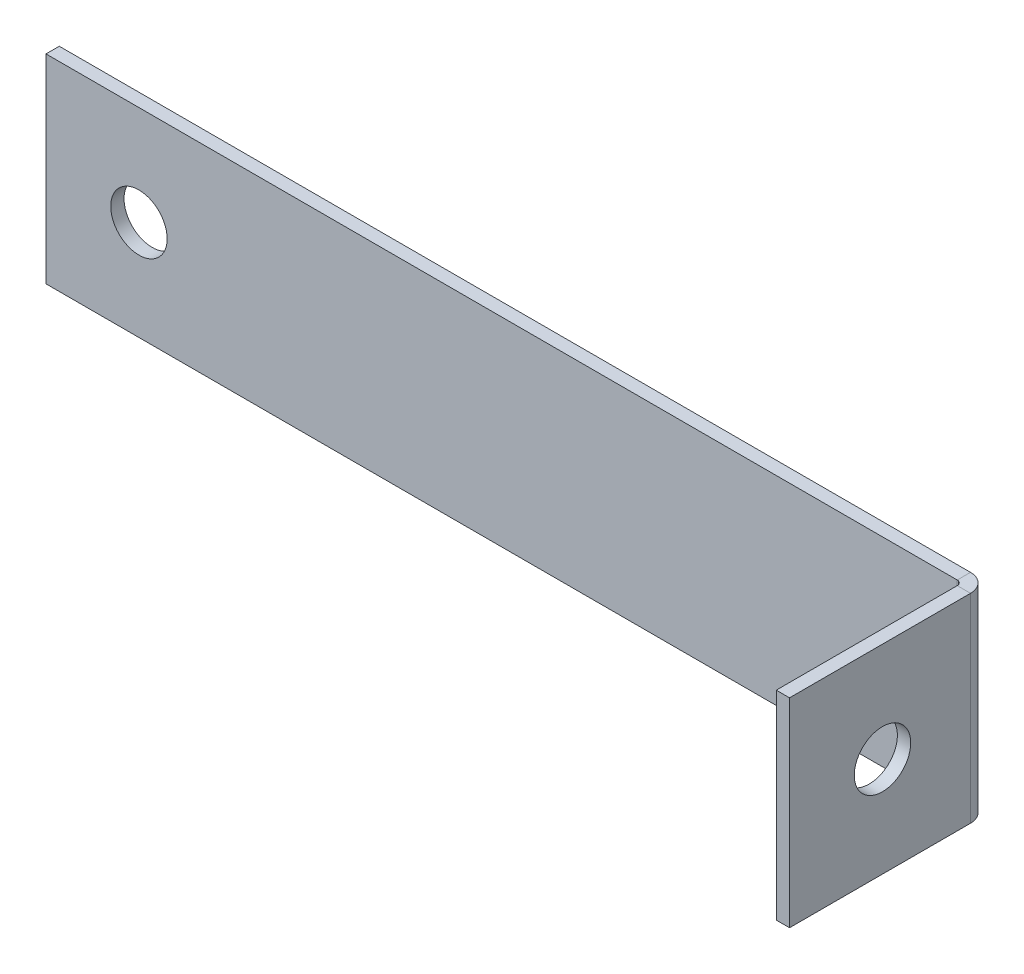
ISO-10303-21;
HEADER;
FILE_DESCRIPTION(('STEP AP214'),'2;1');
FILE_NAME('part.step','',(''),(''),'','','');
FILE_SCHEMA(('AUTOMOTIVE_DESIGN { 1 0 10303 214 1 1 1 1 }'));
ENDSEC;
DATA;
#1=APPLICATION_CONTEXT('core data for automotive mechanical design processes');
#2=APPLICATION_PROTOCOL_DEFINITION('international standard','automotive_design',2000,#1);
#3=PRODUCT_CONTEXT('',#1,'mechanical');
#4=PRODUCT('Part','Part','',(#3));
#5=PRODUCT_RELATED_PRODUCT_CATEGORY('part','',(#4));
#6=PRODUCT_DEFINITION_FORMATION('','',#4);
#7=PRODUCT_DEFINITION_CONTEXT('part definition',#1,'design');
#8=PRODUCT_DEFINITION('design','',#6,#7);
#9=PRODUCT_DEFINITION_SHAPE('','',#8);
#10=(LENGTH_UNIT() NAMED_UNIT(*) SI_UNIT(.MILLI.,.METRE.));
#11=(NAMED_UNIT(*) PLANE_ANGLE_UNIT() SI_UNIT($,.RADIAN.));
#12=(NAMED_UNIT(*) SI_UNIT($,.STERADIAN.) SOLID_ANGLE_UNIT());
#13=UNCERTAINTY_MEASURE_WITH_UNIT(LENGTH_MEASURE(1.E-05),#10,'distance_accuracy_value','');
#14=(GEOMETRIC_REPRESENTATION_CONTEXT(3) GLOBAL_UNCERTAINTY_ASSIGNED_CONTEXT((#13)) GLOBAL_UNIT_ASSIGNED_CONTEXT((#10,
#11,#12)) REPRESENTATION_CONTEXT('',''));
#15=CARTESIAN_POINT('',(0.,0.,0.));
#16=DIRECTION('',(0.,0.,1.));
#17=DIRECTION('',(1.,0.,0.));
#18=AXIS2_PLACEMENT_3D('',#15,#16,#17);
#19=CARTESIAN_POINT('',(60.7597173144876,25.5212014134276,-2.));
#20=DIRECTION('',(0.,1.,0.));
#21=DIRECTION('',(-1.,0.,0.));
#22=AXIS2_PLACEMENT_3D('',#19,#20,#21);
#23=PLANE('',#22);
#24=DIRECTION('',(-1.,0.,0.));
#25=VECTOR('',#24,1.);
#26=CARTESIAN_POINT('',(60.7597173144876,25.5212014134276,0.));
#27=LINE('',#26,#25);
#28=CARTESIAN_POINT('',(58.0231173144876,25.5212014134276,0.));
#29=VERTEX_POINT('',#28);
#30=CARTESIAN_POINT('',(-79.2402826855124,25.5212014134276,0.));
#31=VERTEX_POINT('',#30);
#32=EDGE_CURVE('E108',#29,#31,#27,.T.);
#33=ORIENTED_EDGE('',*,*,#32,.F.);
#34=DIRECTION('',(0.,0.,-1.));
#35=VECTOR('',#34,1.);
#36=CARTESIAN_POINT('',(58.0231173144876,25.5212014134276,0.));
#37=LINE('',#36,#35);
#38=CARTESIAN_POINT('',(58.0231173144876,25.5212014134276,-2.));
#39=VERTEX_POINT('',#38);
#40=EDGE_CURVE('E130',#29,#39,#37,.T.);
#41=ORIENTED_EDGE('',*,*,#40,.T.);
#42=DIRECTION('',(-1.,0.,0.));
#43=VECTOR('',#42,1.);
#44=CARTESIAN_POINT('',(60.7597173144876,25.5212014134276,-2.));
#45=LINE('',#44,#43);
#46=CARTESIAN_POINT('',(-79.2402826855124,25.5212014134276,-2.));
#47=VERTEX_POINT('',#46);
#48=EDGE_CURVE('E113',#39,#47,#45,.T.);
#49=ORIENTED_EDGE('',*,*,#48,.T.);
#50=DIRECTION('',(0.,0.,1.));
#51=VECTOR('',#50,1.);
#52=CARTESIAN_POINT('',(-79.2402826855124,25.5212014134276,-2.));
#53=LINE('',#52,#51);
#54=EDGE_CURVE('E66',#47,#31,#53,.T.);
#55=ORIENTED_EDGE('',*,*,#54,.T.);
#56=EDGE_LOOP('',(#33,#41,#49,#55));
#57=FACE_BOUND('',#56,.T.);
#58=ADVANCED_FACE('F58',(#57),#23,.T.);
#59=CARTESIAN_POINT('',(0.,0.,-2.));
#60=DIRECTION('',(0.,0.,-1.));
#61=DIRECTION('',(-1.,0.,0.));
#62=AXIS2_PLACEMENT_3D('',#59,#60,#61);
#63=PLANE('',#62);
#64=CARTESIAN_POINT('',(-65.2402826855124,10.5212014134276,-2.));
#65=DIRECTION('',(0.,0.,1.));
#66=DIRECTION('',(1.,0.,0.));
#67=AXIS2_PLACEMENT_3D('',#64,#65,#66);
#68=CIRCLE('',#67,4.25000000000001);
#69=CARTESIAN_POINT('',(-60.9902826855124,10.5212014134276,-2.));
#70=VERTEX_POINT('',#69);
#71=EDGE_CURVE('E121',#70,#70,#68,.T.);
#72=ORIENTED_EDGE('',*,*,#71,.T.);
#73=EDGE_LOOP('',(#72));
#74=FACE_BOUND('',#73,.T.);
#75=ORIENTED_EDGE('',*,*,#48,.F.);
#76=DIRECTION('',(0.,1.,0.));
#77=VECTOR('',#76,1.);
#78=CARTESIAN_POINT('',(58.0231173144876,25.5212014134276,-2.));
#79=LINE('',#78,#77);
#80=CARTESIAN_POINT('',(58.0231173144876,-4.47879858657242,-2.));
#81=VERTEX_POINT('',#80);
#82=EDGE_CURVE('E147',#39,#81,#79,.F.);
#83=ORIENTED_EDGE('',*,*,#82,.T.);
#84=DIRECTION('',(1.,0.,0.));
#85=VECTOR('',#84,1.);
#86=CARTESIAN_POINT('',(60.7597173144876,-4.47879858657242,-2.));
#87=LINE('',#86,#85);
#88=CARTESIAN_POINT('',(-79.2402826855124,-4.47879858657244,-2.));
#89=VERTEX_POINT('',#88);
#90=EDGE_CURVE('E117',#89,#81,#87,.T.);
#91=ORIENTED_EDGE('',*,*,#90,.F.);
#92=DIRECTION('',(0.,-1.,0.));
#93=VECTOR('',#92,1.);
#94=CARTESIAN_POINT('',(-79.2402826855124,25.5212014134276,-2.));
#95=LINE('',#94,#93);
#96=EDGE_CURVE('E98',#47,#89,#95,.T.);
#97=ORIENTED_EDGE('',*,*,#96,.F.);
#98=EDGE_LOOP('',(#75,#83,#91,#97));
#99=FACE_BOUND('',#98,.T.);
#100=ADVANCED_FACE('F207',(#74,#99),#63,.T.);
#101=CARTESIAN_POINT('',(0.,0.,0.));
#102=DIRECTION('',(0.,0.,-1.));
#103=DIRECTION('',(-1.,0.,0.));
#104=AXIS2_PLACEMENT_3D('',#101,#102,#103);
#105=PLANE('',#104);
#106=CARTESIAN_POINT('',(-65.2402826855124,10.5212014134276,0.));
#107=DIRECTION('',(0.,0.,1.));
#108=DIRECTION('',(1.,0.,0.));
#109=AXIS2_PLACEMENT_3D('',#106,#107,#108);
#110=CIRCLE('',#109,4.25000000000001);
#111=CARTESIAN_POINT('',(-60.9902826855124,10.5212014134276,0.));
#112=VERTEX_POINT('',#111);
#113=EDGE_CURVE('E123',#112,#112,#110,.T.);
#114=ORIENTED_EDGE('',*,*,#113,.F.);
#115=EDGE_LOOP('',(#114));
#116=FACE_BOUND('',#115,.T.);
#117=DIRECTION('',(0.,1.,0.));
#118=VECTOR('',#117,1.);
#119=CARTESIAN_POINT('',(58.0231173144876,25.5212014134276,0.));
#120=LINE('',#119,#118);
#121=CARTESIAN_POINT('',(58.0231173144876,-4.47879858657242,0.));
#122=VERTEX_POINT('',#121);
#123=EDGE_CURVE('E137',#29,#122,#120,.F.);
#124=ORIENTED_EDGE('',*,*,#123,.F.);
#125=ORIENTED_EDGE('',*,*,#32,.T.);
#126=DIRECTION('',(0.,-1.,0.));
#127=VECTOR('',#126,1.);
#128=CARTESIAN_POINT('',(-79.2402826855124,25.5212014134276,0.));
#129=LINE('',#128,#127);
#130=CARTESIAN_POINT('',(-79.2402826855124,-4.47879858657244,0.));
#131=VERTEX_POINT('',#130);
#132=EDGE_CURVE('E96',#31,#131,#129,.T.);
#133=ORIENTED_EDGE('',*,*,#132,.T.);
#134=DIRECTION('',(1.,0.,0.));
#135=VECTOR('',#134,1.);
#136=CARTESIAN_POINT('',(60.7597173144876,-4.47879858657242,0.));
#137=LINE('',#136,#135);
#138=EDGE_CURVE('E105',#131,#122,#137,.T.);
#139=ORIENTED_EDGE('',*,*,#138,.T.);
#140=EDGE_LOOP('',(#124,#125,#133,#139));
#141=FACE_BOUND('',#140,.T.);
#142=ADVANCED_FACE('F103',(#116,#141),#105,.F.);
#143=CARTESIAN_POINT('',(60.7597173144876,-4.47879858657242,-2.));
#144=DIRECTION('',(0.,-1.,0.));
#145=DIRECTION('',(1.,0.,0.));
#146=AXIS2_PLACEMENT_3D('',#143,#144,#145);
#147=PLANE('',#146);
#148=DIRECTION('',(0.,0.,-1.));
#149=VECTOR('',#148,1.);
#150=CARTESIAN_POINT('',(58.0231173144876,-4.47879858657242,0.));
#151=LINE('',#150,#149);
#152=EDGE_CURVE('E112',#122,#81,#151,.T.);
#153=ORIENTED_EDGE('',*,*,#152,.F.);
#154=ORIENTED_EDGE('',*,*,#138,.F.);
#155=DIRECTION('',(0.,0.,1.));
#156=VECTOR('',#155,1.);
#157=CARTESIAN_POINT('',(-79.2402826855124,-4.47879858657244,-2.));
#158=LINE('',#157,#156);
#159=EDGE_CURVE('E13',#89,#131,#158,.T.);
#160=ORIENTED_EDGE('',*,*,#159,.F.);
#161=ORIENTED_EDGE('',*,*,#90,.T.);
#162=EDGE_LOOP('',(#153,#154,#160,#161));
#163=FACE_BOUND('',#162,.T.);
#164=ADVANCED_FACE('F111',(#163),#147,.T.);
#165=CARTESIAN_POINT('',(-79.2402826855124,25.5212014134276,-2.));
#166=DIRECTION('',(-1.,0.,0.));
#167=DIRECTION('',(0.,0.,1.));
#168=AXIS2_PLACEMENT_3D('',#165,#166,#167);
#169=PLANE('',#168);
#170=ORIENTED_EDGE('',*,*,#132,.F.);
#171=ORIENTED_EDGE('',*,*,#54,.F.);
#172=ORIENTED_EDGE('',*,*,#96,.T.);
#173=ORIENTED_EDGE('',*,*,#159,.T.);
#174=EDGE_LOOP('',(#170,#171,#172,#173));
#175=FACE_BOUND('',#174,.T.);
#176=ADVANCED_FACE('F94',(#175),#169,.T.);
#177=CARTESIAN_POINT('',(-65.2402826855124,10.5212014134276,-2.));
#178=DIRECTION('',(0.,0.,1.));
#179=DIRECTION('',(1.,0.,0.));
#180=AXIS2_PLACEMENT_3D('',#177,#178,#179);
#181=CYLINDRICAL_SURFACE('',#180,4.25000000000001);
#182=ORIENTED_EDGE('',*,*,#71,.F.);
#183=EDGE_LOOP('',(#182));
#184=FACE_BOUND('',#183,.T.);
#185=ORIENTED_EDGE('',*,*,#113,.T.);
#186=EDGE_LOOP('',(#185));
#187=FACE_BOUND('',#186,.T.);
#188=ADVANCED_FACE('F262',(#184,#187),#181,.F.);
#189=CARTESIAN_POINT('',(58.0231173144876,-4.47879858657242,0.7366));
#190=DIRECTION('',(0.,-1.,0.));
#191=DIRECTION('',(0.,0.,-1.));
#192=AXIS2_PLACEMENT_3D('',#189,#190,#191);
#193=PLANE('',#192);
#194=DIRECTION('',(1.,0.,0.));
#195=VECTOR('',#194,1.);
#196=CARTESIAN_POINT('',(60.7597173144876,-4.47879858657242,0.73659999999999));
#197=LINE('',#196,#195);
#198=CARTESIAN_POINT('',(58.7597173144876,-4.47879858657242,0.736599999999997));
#199=VERTEX_POINT('',#198);
#200=CARTESIAN_POINT('',(60.7597173144876,-4.47879858657241,0.73659999999999));
#201=VERTEX_POINT('',#200);
#202=EDGE_CURVE('E151',#199,#201,#197,.T.);
#203=ORIENTED_EDGE('',*,*,#202,.F.);
#204=CARTESIAN_POINT('',(58.0231173144876,-4.47879858657242,0.7366));
#205=DIRECTION('',(0.,1.,0.));
#206=DIRECTION('',(0.,0.,1.));
#207=AXIS2_PLACEMENT_3D('',#204,#205,#206);
#208=CIRCLE('',#207,0.736599999999997);
#209=EDGE_CURVE('E141',#122,#199,#208,.F.);
#210=ORIENTED_EDGE('',*,*,#209,.F.);
#211=ORIENTED_EDGE('',*,*,#152,.T.);
#212=CARTESIAN_POINT('',(58.0231173144876,-4.47879858657241,0.7366));
#213=DIRECTION('',(0.,1.,0.));
#214=DIRECTION('',(0.,0.,1.));
#215=AXIS2_PLACEMENT_3D('',#212,#213,#214);
#216=CIRCLE('',#215,2.7366);
#217=EDGE_CURVE('E74',#81,#201,#216,.F.);
#218=ORIENTED_EDGE('',*,*,#217,.T.);
#219=EDGE_LOOP('',(#203,#210,#211,#218));
#220=FACE_BOUND('',#219,.T.);
#221=ADVANCED_FACE('F260',(#220),#193,.T.);
#222=CARTESIAN_POINT('',(58.0231173144876,25.5212014134276,0.7366));
#223=DIRECTION('',(0.,-1.,0.));
#224=DIRECTION('',(0.,0.,-1.));
#225=AXIS2_PLACEMENT_3D('',#222,#223,#224);
#226=PLANE('',#225);
#227=CARTESIAN_POINT('',(58.0231173144876,25.5212014134276,0.7366));
#228=DIRECTION('',(0.,1.,0.));
#229=DIRECTION('',(0.,0.,1.));
#230=AXIS2_PLACEMENT_3D('',#227,#228,#229);
#231=CIRCLE('',#230,0.736599999999997);
#232=CARTESIAN_POINT('',(58.7597173144876,25.5212014134276,0.736599999999997));
#233=VERTEX_POINT('',#232);
#234=EDGE_CURVE('E134',#233,#29,#231,.T.);
#235=ORIENTED_EDGE('',*,*,#234,.F.);
#236=DIRECTION('',(1.,0.,0.));
#237=VECTOR('',#236,1.);
#238=CARTESIAN_POINT('',(58.7597173144876,25.5212014134276,0.736599999999997));
#239=LINE('',#238,#237);
#240=CARTESIAN_POINT('',(60.7597173144876,25.5212014134276,0.73659999999999));
#241=VERTEX_POINT('',#240);
#242=EDGE_CURVE('E157',#233,#241,#239,.T.);
#243=ORIENTED_EDGE('',*,*,#242,.T.);
#244=CARTESIAN_POINT('',(58.0231173144876,25.5212014134276,0.7366));
#245=DIRECTION('',(0.,1.,0.));
#246=DIRECTION('',(0.,0.,1.));
#247=AXIS2_PLACEMENT_3D('',#244,#245,#246);
#248=CIRCLE('',#247,2.7366);
#249=EDGE_CURVE('E144',#241,#39,#248,.T.);
#250=ORIENTED_EDGE('',*,*,#249,.T.);
#251=ORIENTED_EDGE('',*,*,#40,.F.);
#252=EDGE_LOOP('',(#235,#243,#250,#251));
#253=FACE_BOUND('',#252,.T.);
#254=ADVANCED_FACE('F242',(#253),#226,.F.);
#255=CARTESIAN_POINT('',(58.0231173144876,25.5212014134276,0.7366));
#256=DIRECTION('',(0.,1.,0.));
#257=DIRECTION('',(1.,0.,0.));
#258=AXIS2_PLACEMENT_3D('',#255,#256,#257);
#259=CYLINDRICAL_SURFACE('',#258,2.7366);
#260=ORIENTED_EDGE('',*,*,#82,.F.);
#261=ORIENTED_EDGE('',*,*,#249,.F.);
#262=DIRECTION('',(0.,1.,0.));
#263=VECTOR('',#262,1.);
#264=CARTESIAN_POINT('',(60.7597173144876,0.,0.73659999999999));
#265=LINE('',#264,#263);
#266=EDGE_CURVE('E160',#201,#241,#265,.T.);
#267=ORIENTED_EDGE('',*,*,#266,.F.);
#268=ORIENTED_EDGE('',*,*,#217,.F.);
#269=EDGE_LOOP('',(#260,#261,#267,#268));
#270=FACE_BOUND('',#269,.T.);
#271=ADVANCED_FACE('F240',(#270),#259,.T.);
#272=CARTESIAN_POINT('',(58.0231173144876,25.5212014134276,0.7366));
#273=DIRECTION('',(0.,1.,0.));
#274=DIRECTION('',(1.,0.,0.));
#275=AXIS2_PLACEMENT_3D('',#272,#273,#274);
#276=CYLINDRICAL_SURFACE('',#275,0.736599999999997);
#277=ORIENTED_EDGE('',*,*,#123,.T.);
#278=ORIENTED_EDGE('',*,*,#209,.T.);
#279=DIRECTION('',(0.,-1.,0.));
#280=VECTOR('',#279,1.);
#281=CARTESIAN_POINT('',(58.7597173144876,-4.47879858657243,0.736599999999997));
#282=LINE('',#281,#280);
#283=EDGE_CURVE('E154',#199,#233,#282,.F.);
#284=ORIENTED_EDGE('',*,*,#283,.T.);
#285=ORIENTED_EDGE('',*,*,#234,.T.);
#286=EDGE_LOOP('',(#277,#278,#284,#285));
#287=FACE_BOUND('',#286,.T.);
#288=ADVANCED_FACE('F259',(#287),#276,.F.);
#289=CARTESIAN_POINT('',(60.7597173144876,25.5212014134276,0.));
#290=DIRECTION('',(0.,1.,0.));
#291=DIRECTION('',(0.,0.,1.));
#292=AXIS2_PLACEMENT_3D('',#289,#290,#291);
#293=PLANE('',#292);
#294=DIRECTION('',(0.,0.,-1.));
#295=VECTOR('',#294,1.);
#296=CARTESIAN_POINT('',(60.7597173144876,25.5212014134276,0.));
#297=LINE('',#296,#295);
#298=CARTESIAN_POINT('',(60.7597173144877,25.5212014134276,28.));
#299=VERTEX_POINT('',#298);
#300=EDGE_CURVE('E178',#299,#241,#297,.T.);
#301=ORIENTED_EDGE('',*,*,#300,.T.);
#302=ORIENTED_EDGE('',*,*,#242,.F.);
#303=DIRECTION('',(0.,0.,1.));
#304=VECTOR('',#303,1.);
#305=CARTESIAN_POINT('',(58.7597173144876,25.5212014134276,-2.23451823817457E-13));
#306=LINE('',#305,#304);
#307=CARTESIAN_POINT('',(58.7597173144877,25.5212014134276,28.));
#308=VERTEX_POINT('',#307);
#309=EDGE_CURVE('E169',#308,#233,#306,.F.);
#310=ORIENTED_EDGE('',*,*,#309,.F.);
#311=DIRECTION('',(-1.,0.,0.));
#312=VECTOR('',#311,1.);
#313=CARTESIAN_POINT('',(60.7597173144877,25.5212014134276,28.));
#314=LINE('',#313,#312);
#315=EDGE_CURVE('E138',#299,#308,#314,.T.);
#316=ORIENTED_EDGE('',*,*,#315,.F.);
#317=EDGE_LOOP('',(#301,#302,#310,#316));
#318=FACE_BOUND('',#317,.T.);
#319=ADVANCED_FACE('F251',(#318),#293,.T.);
#320=CARTESIAN_POINT('',(60.7597173144877,-4.47879858657243,28.));
#321=DIRECTION('',(0.,-1.,0.));
#322=DIRECTION('',(0.,0.,-1.));
#323=AXIS2_PLACEMENT_3D('',#320,#321,#322);
#324=PLANE('',#323);
#325=DIRECTION('',(0.,0.,-1.));
#326=VECTOR('',#325,1.);
#327=CARTESIAN_POINT('',(58.7597173144876,-4.47879858657242,-2.11635060008202E-13));
#328=LINE('',#327,#326);
#329=CARTESIAN_POINT('',(58.7597173144877,-4.47879858657243,28.));
#330=VERTEX_POINT('',#329);
#331=EDGE_CURVE('E163',#199,#330,#328,.F.);
#332=ORIENTED_EDGE('',*,*,#331,.F.);
#333=ORIENTED_EDGE('',*,*,#202,.T.);
#334=DIRECTION('',(0.,0.,1.));
#335=VECTOR('',#334,1.);
#336=CARTESIAN_POINT('',(60.7597173144877,-4.47879858657243,28.));
#337=LINE('',#336,#335);
#338=CARTESIAN_POINT('',(60.7597173144877,-4.47879858657243,28.));
#339=VERTEX_POINT('',#338);
#340=EDGE_CURVE('E172',#201,#339,#337,.T.);
#341=ORIENTED_EDGE('',*,*,#340,.T.);
#342=DIRECTION('',(-1.,0.,0.));
#343=VECTOR('',#342,1.);
#344=CARTESIAN_POINT('',(60.7597173144877,-4.47879858657243,28.));
#345=LINE('',#344,#343);
#346=EDGE_CURVE('E181',#339,#330,#345,.T.);
#347=ORIENTED_EDGE('',*,*,#346,.T.);
#348=EDGE_LOOP('',(#332,#333,#341,#347));
#349=FACE_BOUND('',#348,.T.);
#350=ADVANCED_FACE('F256',(#349),#324,.T.);
#351=CARTESIAN_POINT('',(60.7597173144876,0.,-2.17785578715999E-13));
#352=DIRECTION('',(1.,0.,0.));
#353=DIRECTION('',(0.,0.,-1.));
#354=AXIS2_PLACEMENT_3D('',#351,#352,#353);
#355=PLANE('',#354);
#356=CARTESIAN_POINT('',(60.7597173144877,10.5212014134276,13.9999999999998));
#357=DIRECTION('',(1.,0.,0.));
#358=DIRECTION('',(0.,0.,-1.));
#359=AXIS2_PLACEMENT_3D('',#356,#357,#358);
#360=CIRCLE('',#359,4.25);
#361=CARTESIAN_POINT('',(60.7597173144877,10.5212014134276,9.74999999999979));
#362=VERTEX_POINT('',#361);
#363=EDGE_CURVE('E186',#362,#362,#360,.T.);
#364=ORIENTED_EDGE('',*,*,#363,.F.);
#365=EDGE_LOOP('',(#364));
#366=FACE_BOUND('',#365,.T.);
#367=ORIENTED_EDGE('',*,*,#340,.F.);
#368=ORIENTED_EDGE('',*,*,#266,.T.);
#369=ORIENTED_EDGE('',*,*,#300,.F.);
#370=DIRECTION('',(0.,1.,0.));
#371=VECTOR('',#370,1.);
#372=CARTESIAN_POINT('',(60.7597173144877,25.5212014134276,28.));
#373=LINE('',#372,#371);
#374=EDGE_CURVE('E175',#339,#299,#373,.T.);
#375=ORIENTED_EDGE('',*,*,#374,.F.);
#376=EDGE_LOOP('',(#367,#368,#369,#375));
#377=FACE_BOUND('',#376,.T.);
#378=ADVANCED_FACE('F249',(#366,#377),#355,.T.);
#379=CARTESIAN_POINT('',(58.7597173144876,0.,-2.10802616038312E-13));
#380=DIRECTION('',(1.,0.,0.));
#381=DIRECTION('',(0.,0.,-1.));
#382=AXIS2_PLACEMENT_3D('',#379,#380,#381);
#383=PLANE('',#382);
#384=CARTESIAN_POINT('',(58.7597173144877,10.5212014134276,13.9999999999998));
#385=DIRECTION('',(1.,0.,0.));
#386=DIRECTION('',(0.,0.,-1.));
#387=AXIS2_PLACEMENT_3D('',#384,#385,#386);
#388=CIRCLE('',#387,4.25);
#389=CARTESIAN_POINT('',(58.7597173144877,10.5212014134276,9.7499999999998));
#390=VERTEX_POINT('',#389);
#391=EDGE_CURVE('E61',#390,#390,#388,.T.);
#392=ORIENTED_EDGE('',*,*,#391,.T.);
#393=EDGE_LOOP('',(#392));
#394=FACE_BOUND('',#393,.T.);
#395=ORIENTED_EDGE('',*,*,#283,.F.);
#396=ORIENTED_EDGE('',*,*,#331,.T.);
#397=DIRECTION('',(0.,-1.,0.));
#398=VECTOR('',#397,1.);
#399=CARTESIAN_POINT('',(58.7597173144877,0.,28.));
#400=LINE('',#399,#398);
#401=EDGE_CURVE('E166',#330,#308,#400,.F.);
#402=ORIENTED_EDGE('',*,*,#401,.T.);
#403=ORIENTED_EDGE('',*,*,#309,.T.);
#404=EDGE_LOOP('',(#395,#396,#402,#403));
#405=FACE_BOUND('',#404,.T.);
#406=ADVANCED_FACE('F193',(#394,#405),#383,.F.);
#407=CARTESIAN_POINT('',(60.7597173144877,25.5212014134276,28.));
#408=DIRECTION('',(0.,0.,1.));
#409=DIRECTION('',(1.,0.,0.));
#410=AXIS2_PLACEMENT_3D('',#407,#408,#409);
#411=PLANE('',#410);
#412=ORIENTED_EDGE('',*,*,#401,.F.);
#413=ORIENTED_EDGE('',*,*,#346,.F.);
#414=ORIENTED_EDGE('',*,*,#374,.T.);
#415=ORIENTED_EDGE('',*,*,#315,.T.);
#416=EDGE_LOOP('',(#412,#413,#414,#415));
#417=FACE_BOUND('',#416,.T.);
#418=ADVANCED_FACE('F198',(#417),#411,.T.);
#419=CARTESIAN_POINT('',(50.7597173144877,10.5212014134276,13.9999999999998));
#420=DIRECTION('',(1.,0.,0.));
#421=DIRECTION('',(0.,0.,-1.));
#422=AXIS2_PLACEMENT_3D('',#419,#420,#421);
#423=CYLINDRICAL_SURFACE('',#422,4.25);
#424=ORIENTED_EDGE('',*,*,#363,.T.);
#425=EDGE_LOOP('',(#424));
#426=FACE_BOUND('',#425,.T.);
#427=ORIENTED_EDGE('',*,*,#391,.F.);
#428=EDGE_LOOP('',(#427));
#429=FACE_BOUND('',#428,.T.);
#430=ADVANCED_FACE('F196',(#426,#429),#423,.F.);
#431=CLOSED_SHELL('',(#58,#100,#142,#164,#176,#188,#221,#254,#271,#288,#319,#350,#378,#406,#418,#430));
#432=MANIFOLD_SOLID_BREP('B2',#431);
#433=ADVANCED_BREP_SHAPE_REPRESENTATION('',(#18,#432),#14);
#434=SHAPE_DEFINITION_REPRESENTATION(#9,#433);
ENDSEC;
END-ISO-10303-21;
